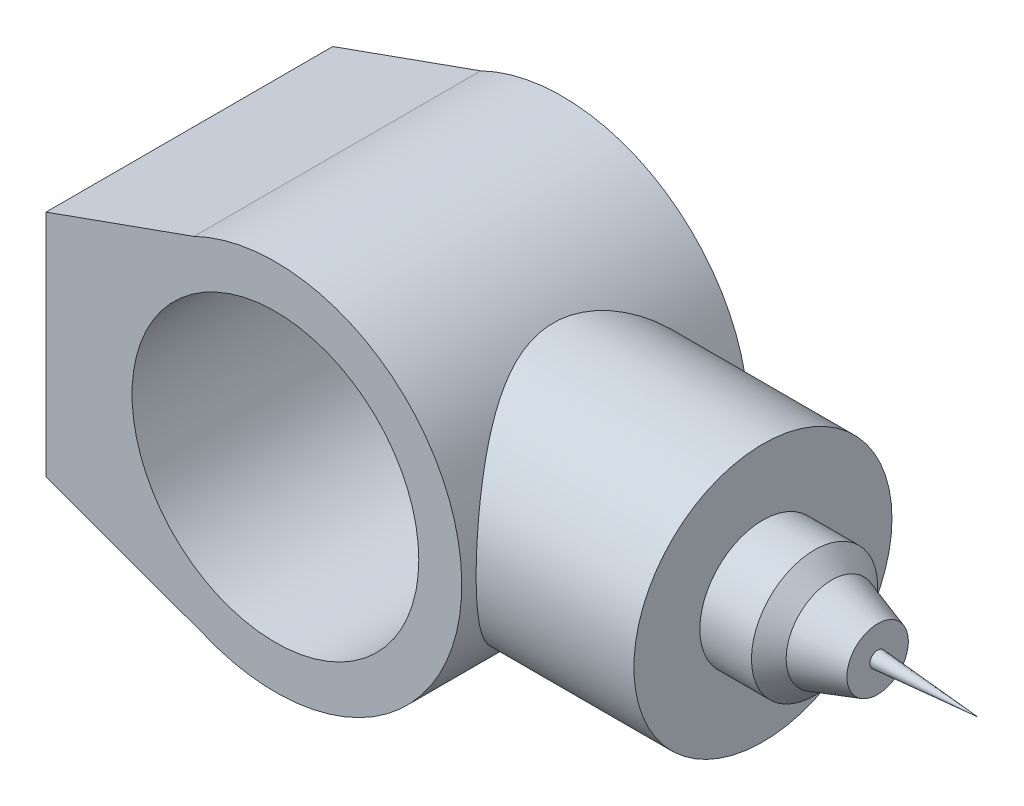
ISO-10303-21;
HEADER;
FILE_DESCRIPTION(('STEP AP214'),'2;1');
FILE_NAME('part.step','',(''),(''),'','','');
FILE_SCHEMA(('AUTOMOTIVE_DESIGN { 1 0 10303 214 1 1 1 1 }'));
ENDSEC;
DATA;
#1=APPLICATION_CONTEXT('core data for automotive mechanical design processes');
#2=APPLICATION_PROTOCOL_DEFINITION('international standard','automotive_design',2000,#1);
#3=PRODUCT_CONTEXT('',#1,'mechanical');
#4=PRODUCT('Part','Part','',(#3));
#5=PRODUCT_RELATED_PRODUCT_CATEGORY('part','',(#4));
#6=PRODUCT_DEFINITION_FORMATION('','',#4);
#7=PRODUCT_DEFINITION_CONTEXT('part definition',#1,'design');
#8=PRODUCT_DEFINITION('design','',#6,#7);
#9=PRODUCT_DEFINITION_SHAPE('','',#8);
#10=(LENGTH_UNIT() NAMED_UNIT(*) SI_UNIT(.MILLI.,.METRE.));
#11=(NAMED_UNIT(*) PLANE_ANGLE_UNIT() SI_UNIT($,.RADIAN.));
#12=(NAMED_UNIT(*) SI_UNIT($,.STERADIAN.) SOLID_ANGLE_UNIT());
#13=UNCERTAINTY_MEASURE_WITH_UNIT(LENGTH_MEASURE(1.E-05),#10,'distance_accuracy_value','');
#14=(GEOMETRIC_REPRESENTATION_CONTEXT(3) GLOBAL_UNCERTAINTY_ASSIGNED_CONTEXT((#13)) GLOBAL_UNIT_ASSIGNED_CONTEXT((#10,
#11,#12)) REPRESENTATION_CONTEXT('',''));
#15=CARTESIAN_POINT('',(0.,0.,0.));
#16=DIRECTION('',(0.,0.,1.));
#17=DIRECTION('',(1.,0.,0.));
#18=AXIS2_PLACEMENT_3D('',#15,#16,#17);
#19=CARTESIAN_POINT('',(0.,0.,500.));
#20=DIRECTION('',(0.,0.,1.));
#21=DIRECTION('',(1.,0.,0.));
#22=AXIS2_PLACEMENT_3D('',#19,#20,#21);
#23=PLANE('',#22);
#24=DIRECTION('',(0.940002007833279,-0.341168910174131,0.));
#25=VECTOR('',#24,1.);
#26=CARTESIAN_POINT('',(-800.,-400.,500.));
#27=LINE('',#26,#25);
#28=CARTESIAN_POINT('',(-800.,-400.,500.));
#29=VERTEX_POINT('',#28);
#30=CARTESIAN_POINT('',(-256.343570218804,-597.317314337595,500.));
#31=VERTEX_POINT('',#30);
#32=EDGE_CURVE('E191',#29,#31,#27,.T.);
#33=ORIENTED_EDGE('',*,*,#32,.T.);
#34=CARTESIAN_POINT('',(0.,0.,500.));
#35=DIRECTION('',(0.,0.,1.));
#36=DIRECTION('',(1.,0.,0.));
#37=AXIS2_PLACEMENT_3D('',#34,#35,#36);
#38=CIRCLE('',#37,650.);
#39=CARTESIAN_POINT('',(-284.326048032078,584.51578114749,500.));
#40=VERTEX_POINT('',#39);
#41=EDGE_CURVE('E88',#31,#40,#38,.T.);
#42=ORIENTED_EDGE('',*,*,#41,.T.);
#43=DIRECTION('',(-0.941541348464522,-0.336897446015267,0.));
#44=VECTOR('',#43,1.);
#45=CARTESIAN_POINT('',(-800.,400.,500.));
#46=LINE('',#45,#44);
#47=CARTESIAN_POINT('',(-800.,400.,500.));
#48=VERTEX_POINT('',#47);
#49=EDGE_CURVE('E184',#40,#48,#46,.T.);
#50=ORIENTED_EDGE('',*,*,#49,.T.);
#51=DIRECTION('',(0.,-1.,0.));
#52=VECTOR('',#51,1.);
#53=CARTESIAN_POINT('',(-800.,400.,500.));
#54=LINE('',#53,#52);
#55=EDGE_CURVE('E57',#48,#29,#54,.T.);
#56=ORIENTED_EDGE('',*,*,#55,.T.);
#57=EDGE_LOOP('',(#33,#42,#50,#56));
#58=FACE_BOUND('',#57,.T.);
#59=CARTESIAN_POINT('',(0.,0.,500.));
#60=DIRECTION('',(0.,0.,1.));
#61=DIRECTION('',(1.,0.,0.));
#62=AXIS2_PLACEMENT_3D('',#59,#60,#61);
#63=CIRCLE('',#62,500.);
#64=CARTESIAN_POINT('',(500.,0.,500.));
#65=VERTEX_POINT('',#64);
#66=EDGE_CURVE('E206',#65,#65,#63,.T.);
#67=ORIENTED_EDGE('',*,*,#66,.F.);
#68=EDGE_LOOP('',(#67));
#69=FACE_BOUND('',#68,.T.);
#70=ADVANCED_FACE('F39',(#58,#69),#23,.T.);
#71=CARTESIAN_POINT('',(0.,0.,-500.));
#72=DIRECTION('',(0.,0.,1.));
#73=DIRECTION('',(1.,0.,0.));
#74=AXIS2_PLACEMENT_3D('',#71,#72,#73);
#75=PLANE('',#74);
#76=DIRECTION('',(0.940002007833279,-0.341168910174131,0.));
#77=VECTOR('',#76,1.);
#78=CARTESIAN_POINT('',(-800.,-400.,-500.));
#79=LINE('',#78,#77);
#80=CARTESIAN_POINT('',(-800.,-400.,-500.));
#81=VERTEX_POINT('',#80);
#82=CARTESIAN_POINT('',(-256.343570218804,-597.317314337595,-500.));
#83=VERTEX_POINT('',#82);
#84=EDGE_CURVE('E182',#81,#83,#79,.T.);
#85=ORIENTED_EDGE('',*,*,#84,.F.);
#86=DIRECTION('',(0.,-1.,0.));
#87=VECTOR('',#86,1.);
#88=CARTESIAN_POINT('',(-800.,400.,-500.));
#89=LINE('',#88,#87);
#90=CARTESIAN_POINT('',(-800.,400.,-500.));
#91=VERTEX_POINT('',#90);
#92=EDGE_CURVE('E81',#91,#81,#89,.T.);
#93=ORIENTED_EDGE('',*,*,#92,.F.);
#94=DIRECTION('',(-0.941541348464522,-0.336897446015267,0.));
#95=VECTOR('',#94,1.);
#96=CARTESIAN_POINT('',(-800.,400.,-500.));
#97=LINE('',#96,#95);
#98=CARTESIAN_POINT('',(-284.326048032078,584.51578114749,-500.));
#99=VERTEX_POINT('',#98);
#100=EDGE_CURVE('E75',#99,#91,#97,.T.);
#101=ORIENTED_EDGE('',*,*,#100,.F.);
#102=CARTESIAN_POINT('',(0.,0.,-500.));
#103=DIRECTION('',(0.,0.,1.));
#104=DIRECTION('',(1.,0.,0.));
#105=AXIS2_PLACEMENT_3D('',#102,#103,#104);
#106=CIRCLE('',#105,650.);
#107=EDGE_CURVE('E176',#83,#99,#106,.T.);
#108=ORIENTED_EDGE('',*,*,#107,.F.);
#109=EDGE_LOOP('',(#85,#93,#101,#108));
#110=FACE_BOUND('',#109,.T.);
#111=CARTESIAN_POINT('',(0.,0.,-500.));
#112=DIRECTION('',(0.,0.,1.));
#113=DIRECTION('',(1.,0.,0.));
#114=AXIS2_PLACEMENT_3D('',#111,#112,#113);
#115=CIRCLE('',#114,500.);
#116=CARTESIAN_POINT('',(500.,0.,-500.));
#117=VERTEX_POINT('',#116);
#118=EDGE_CURVE('E209',#117,#117,#115,.T.);
#119=ORIENTED_EDGE('',*,*,#118,.T.);
#120=EDGE_LOOP('',(#119));
#121=FACE_BOUND('',#120,.T.);
#122=ADVANCED_FACE('F155',(#110,#121),#75,.F.);
#123=CARTESIAN_POINT('',(-800.,-400.,500.));
#124=DIRECTION('',(0.341168910174131,0.940002007833279,0.));
#125=DIRECTION('',(-0.940002007833279,0.341168910174131,0.));
#126=AXIS2_PLACEMENT_3D('',#123,#124,#125);
#127=PLANE('',#126);
#128=ORIENTED_EDGE('',*,*,#84,.T.);
#129=DIRECTION('',(0.,0.,-1.));
#130=VECTOR('',#129,1.);
#131=CARTESIAN_POINT('',(-256.343570218804,-597.317314337595,500.));
#132=LINE('',#131,#130);
#133=EDGE_CURVE('E11',#31,#83,#132,.T.);
#134=ORIENTED_EDGE('',*,*,#133,.F.);
#135=ORIENTED_EDGE('',*,*,#32,.F.);
#136=DIRECTION('',(0.,0.,-1.));
#137=VECTOR('',#136,1.);
#138=CARTESIAN_POINT('',(-800.,-400.,500.));
#139=LINE('',#138,#137);
#140=EDGE_CURVE('E195',#29,#81,#139,.T.);
#141=ORIENTED_EDGE('',*,*,#140,.T.);
#142=EDGE_LOOP('',(#128,#134,#135,#141));
#143=FACE_BOUND('',#142,.T.);
#144=ADVANCED_FACE('F41',(#143),#127,.F.);
#145=CARTESIAN_POINT('',(0.,0.,500.));
#146=DIRECTION('',(0.,0.,-1.));
#147=DIRECTION('',(-1.,0.,0.));
#148=AXIS2_PLACEMENT_3D('',#145,#146,#147);
#149=CYLINDRICAL_SURFACE('',#148,650.);
#150=CARTESIAN_POINT('',(650.,0.,-450.));
#151=CARTESIAN_POINT('',(650.000000819909,5.60735448326354,-450.000000874373));
#152=CARTESIAN_POINT('',(649.927403210005,11.2146861362403,-449.895156959561));
#153=CARTESIAN_POINT('',(649.63746991911,22.4177465576838,-449.476212092785));
#154=CARTESIAN_POINT('',(649.420135102394,28.0134753952345,-449.162112390356));
#155=CARTESIAN_POINT('',(648.842087681497,39.1817691708137,-448.32593717228));
#156=CARTESIAN_POINT('',(648.481378840438,44.7543347129279,-447.803867115207));
#157=CARTESIAN_POINT('',(647.618804173417,55.8653233636817,-446.553826656444));
#158=CARTESIAN_POINT('',(647.116938089727,61.4037464099647,-445.825855878818));
#159=CARTESIAN_POINT('',(645.974897280944,72.4375973578085,-444.166556842931));
#160=CARTESIAN_POINT('',(645.334675523368,77.9330099785567,-443.235159430883));
#161=CARTESIAN_POINT('',(643.91982926804,88.8687342421325,-441.172652681231));
#162=CARTESIAN_POINT('',(643.145204741963,94.3090458733477,-440.041543301539));
#163=CARTESIAN_POINT('',(641.466040982058,105.125021827595,-437.583691431635));
#164=CARTESIAN_POINT('',(640.561501022899,110.500685789512,-436.256947849179));
#165=CARTESIAN_POINT('',(638.627608420713,121.178450692091,-433.41240179995));
#166=CARTESIAN_POINT('',(637.598255819654,126.48055165749,-431.894599397423));
#167=CARTESIAN_POINT('',(635.425768160247,136.976911844193,-428.680885766921));
#168=CARTESIAN_POINT('',(634.283223366166,142.171575778475,-426.985896201959));
#169=CARTESIAN_POINT('',(631.886097278452,152.472703749141,-423.416801666323));
#170=CARTESIAN_POINT('',(630.63151608328,157.579167863034,-421.542696853062));
#171=CARTESIAN_POINT('',(628.016674999887,167.697223968914,-417.620737119684));
#172=CARTESIAN_POINT('',(626.656417578098,172.708818171727,-415.572886254614));
#173=CARTESIAN_POINT('',(623.836810050851,182.631423926088,-411.308793519383));
#174=CARTESIAN_POINT('',(622.377459820085,187.542435350434,-409.092551436281));
#175=CARTESIAN_POINT('',(619.366542851209,197.258593533155,-404.497129035471));
#176=CARTESIAN_POINT('',(617.814978344527,202.063742849357,-402.117952660284));
#177=CARTESIAN_POINT('',(614.626617263451,211.563762782533,-397.201937361689));
#178=CARTESIAN_POINT('',(612.989820915786,216.258633692815,-394.665098857683));
#179=CARTESIAN_POINT('',(609.638083043462,225.534313806631,-389.438842938195));
#180=CARTESIAN_POINT('',(607.923139157841,230.1151195576,-386.749420912321));
#181=CARTESIAN_POINT('',(604.422390562658,239.159124959121,-381.223028745398));
#182=CARTESIAN_POINT('',(602.636585093933,243.622323348855,-378.386057023502));
#183=CARTESIAN_POINT('',(598.842327387006,252.813570367209,-372.314693446354));
#184=CARTESIAN_POINT('',(596.828068972455,257.530605705433,-369.067251028323));
#185=CARTESIAN_POINT('',(592.733929761899,266.818754136987,-362.409166112294));
#186=CARTESIAN_POINT('',(590.654048079459,271.389865257503,-358.998521409448));
#187=CARTESIAN_POINT('',(586.438246947194,280.383393417811,-352.019249824947));
#188=CARTESIAN_POINT('',(584.302325907629,284.805806231152,-348.450618459506));
#189=CARTESIAN_POINT('',(579.984258706197,293.499259359902,-341.160323385042));
#190=CARTESIAN_POINT('',(577.80211262573,297.770299941836,-337.438659945492));
#191=CARTESIAN_POINT('',(573.398466001337,306.164487771874,-329.841470322231));
#192=CARTESIAN_POINT('',(571.176915566076,310.287424048353,-325.965740024425));
#193=CARTESIAN_POINT('',(566.707517540193,318.37704678997,-318.069183800029));
#194=CARTESIAN_POINT('',(564.459670072296,322.34373398393,-314.0483585504));
#195=CARTESIAN_POINT('',(559.947923215529,330.118957790286,-305.864890092382));
#196=CARTESIAN_POINT('',(557.684023100944,333.927487198572,-301.702240439559));
#197=CARTESIAN_POINT('',(553.150917051217,341.384096988457,-293.238314795031));
#198=CARTESIAN_POINT('',(550.881710999232,345.032173801003,-288.937035723386));
#199=CARTESIAN_POINT('',(545.959207282111,352.779066684507,-279.447001589225));
#200=CARTESIAN_POINT('',(543.306972217361,356.847497036008,-274.232840983926));
#201=CARTESIAN_POINT('',(538.028913090799,364.756759565165,-263.621504406309));
#202=CARTESIAN_POINT('',(535.403089787306,368.597585223371,-258.224323198551));
#203=CARTESIAN_POINT('',(530.196809449092,376.047870512711,-247.248866252988));
#204=CARTESIAN_POINT('',(527.616364367663,379.657269826135,-241.670543869636));
#205=CARTESIAN_POINT('',(522.522375241127,386.638122025411,-230.337265840221));
#206=CARTESIAN_POINT('',(520.00883027164,390.009578200065,-224.582312637091));
#207=CARTESIAN_POINT('',(515.073934002506,396.504039693009,-212.906348871407));
#208=CARTESIAN_POINT('',(512.652466995795,399.627362588383,-206.985564127364));
#209=CARTESIAN_POINT('',(507.92171687634,405.623117209003,-194.974215933042));
#210=CARTESIAN_POINT('',(505.612436981933,408.495541738552,-188.883647620019));
#211=CARTESIAN_POINT('',(501.131881137214,413.979915608787,-176.539561927493));
#212=CARTESIAN_POINT('',(498.960546046449,416.591976850894,-170.28611602139));
#213=CARTESIAN_POINT('',(495.826271825366,420.308143127775,-160.787513074257));
#214=CARTESIAN_POINT('',(494.80199235564,421.513183588448,-157.601653513431));
#215=CARTESIAN_POINT('',(492.797541599884,423.854878577852,-151.190897350712));
#216=CARTESIAN_POINT('',(491.817372604764,424.991529555757,-147.965998732308));
#217=CARTESIAN_POINT('',(489.53457036154,427.621326873819,-140.223302532042));
#218=CARTESIAN_POINT('',(488.253895599728,429.082257956713,-135.688013866448));
#219=CARTESIAN_POINT('',(485.793325579629,431.866062741324,-126.548499775889));
#220=CARTESIAN_POINT('',(484.61342519084,433.188943472053,-121.944277874412));
#221=CARTESIAN_POINT('',(482.36356361326,435.692810924993,-112.671358596193));
#222=CARTESIAN_POINT('',(481.293589507026,436.873814321983,-108.002668868378));
#223=CARTESIAN_POINT('',(479.272312706538,439.090310231464,-98.6052992628276));
#224=CARTESIAN_POINT('',(478.321011366921,440.125801082959,-93.876618700981));
#225=CARTESIAN_POINT('',(476.546995540197,442.046001565262,-84.3729554241327));
#226=CARTESIAN_POINT('',(475.724076121008,442.930951708024,-79.598059695749));
#227=CARTESIAN_POINT('',(474.212758121207,444.548631690904,-70.001368946452));
#228=CARTESIAN_POINT('',(473.524358885131,445.281362272728,-65.1795741541795));
#229=CARTESIAN_POINT('',(472.288928882528,446.591512458957,-55.4967504410991));
#230=CARTESIAN_POINT('',(471.741901262738,447.168928606286,-50.6357206494569));
#231=CARTESIAN_POINT('',(470.794945593637,448.165808974127,-40.8831718362629));
#232=CARTESIAN_POINT('',(470.395017710037,448.585273016701,-35.9916527803707));
#233=CARTESIAN_POINT('',(469.744834446091,449.266083500543,-26.1609199994822));
#234=CARTESIAN_POINT('',(469.495401528478,449.526561161451,-21.2215914469815));
#235=CARTESIAN_POINT('',(469.15240817099,449.884518015706,-11.3316058365826));
#236=CARTESIAN_POINT('',(469.058847812111,449.981997124355,-6.38094877279899));
#237=CARTESIAN_POINT('',(469.028662632765,450.013459946033,3.5213591755549));
#238=CARTESIAN_POINT('',(469.092037602306,449.947443877832,8.47301005878656));
#239=CARTESIAN_POINT('',(469.375001640919,449.652253906846,18.3669553978904));
#240=CARTESIAN_POINT('',(469.594590651175,449.42308006549,23.3092498572846));
#241=CARTESIAN_POINT('',(470.187688901759,448.802541389342,33.1773235140838));
#242=CARTESIAN_POINT('',(470.56129012844,448.411079624603,38.103091064974));
#243=CARTESIAN_POINT('',(471.458306867068,447.467862463318,47.9255153600554));
#244=CARTESIAN_POINT('',(471.981722914146,446.91610649421,52.8221720002001));
#245=CARTESIAN_POINT('',(473.172797112469,445.654861705661,62.5774238688978));
#246=CARTESIAN_POINT('',(473.840455776078,444.945372325935,67.436018962189));
#247=CARTESIAN_POINT('',(475.313213593544,443.371751184742,77.1070129615799));
#248=CARTESIAN_POINT('',(476.118311610456,442.507620702518,81.9194122494795));
#249=CARTESIAN_POINT('',(477.805192006275,440.685424715542,91.1994270571938));
#250=CARTESIAN_POINT('',(478.679320952941,439.736281784658,95.6701952256573));
#251=CARTESIAN_POINT('',(480.534905201015,437.707772468309,104.559502012579));
#252=CARTESIAN_POINT('',(481.516359224419,436.628407633483,108.978041252275));
#253=CARTESIAN_POINT('',(483.579079172385,434.342771445386,117.757940043559));
#254=CARTESIAN_POINT('',(484.660332506468,433.136516097691,122.119306728855));
#255=CARTESIAN_POINT('',(486.915229524819,430.600091476401,130.78200354183));
#256=CARTESIAN_POINT('',(488.088880166584,429.269912870026,135.083329119661));
#257=CARTESIAN_POINT('',(490.521492675331,426.48807754917,143.624872838719));
#258=CARTESIAN_POINT('',(491.780500688678,425.036355023715,147.865056398517));
#259=CARTESIAN_POINT('',(494.375496694087,422.015207058528,156.279072550163));
#260=CARTESIAN_POINT('',(495.711483598354,420.445783281949,160.452906078546));
#261=CARTESIAN_POINT('',(499.82407840081,415.564659890422,172.873238637371));
#262=CARTESIAN_POINT('',(502.705252757621,412.080184919393,181.018334841964));
#263=CARTESIAN_POINT('',(507.961008092489,405.571965186945,195.079430096909));
#264=CARTESIAN_POINT('',(510.288884258519,402.641571495044,201.056765600333));
#265=CARTESIAN_POINT('',(515.047283718722,396.536595522342,212.844499633203));
#266=CARTESIAN_POINT('',(517.477815982988,393.361991882479,218.654883499562));
#267=CARTESIAN_POINT('',(522.419656154597,386.774693221208,230.106470187074));
#268=CARTESIAN_POINT('',(524.930990845925,383.361918804664,235.747615687259));
#269=CARTESIAN_POINT('',(530.012606823902,376.305117294406,246.855735176086));
#270=CARTESIAN_POINT('',(532.582886736164,372.66109558904,252.322713218589));
#271=CARTESIAN_POINT('',(537.767155985266,365.140223270321,263.088980498944));
#272=CARTESIAN_POINT('',(540.381213559624,361.262978789571,268.387961594952));
#273=CARTESIAN_POINT('',(545.629896197215,353.285738573182,278.804993874369));
#274=CARTESIAN_POINT('',(548.26452137527,349.185741593212,283.923044046805));
#275=CARTESIAN_POINT('',(553.536135374502,340.76738202179,293.973734984431));
#276=CARTESIAN_POINT('',(556.173123852062,336.44904729687,298.906399271102));
#277=CARTESIAN_POINT('',(561.432719302883,327.597019889698,308.582547668722));
#278=CARTESIAN_POINT('',(564.055326281339,323.063327285238,313.326031848006));
#279=CARTESIAN_POINT('',(569.297492606752,313.73443584979,322.66816132737));
#280=CARTESIAN_POINT('',(571.916721553632,308.936964856633,327.264724071866));
#281=CARTESIAN_POINT('',(577.107180587542,299.128880515629,336.253118711368));
#282=CARTESIAN_POINT('',(579.678410518676,294.118266475689,340.644949941496));
#283=CARTESIAN_POINT('',(584.757017079361,283.887040557402,349.217257344969));
#284=CARTESIAN_POINT('',(587.264386661161,278.666405663351,353.39771023993));
#285=CARTESIAN_POINT('',(592.199110042117,268.01984800001,361.538748513944));
#286=CARTESIAN_POINT('',(594.626464294832,262.593926394744,365.499335139377));
#287=CARTESIAN_POINT('',(599.381309319481,251.551419464176,373.185011169578));
#288=CARTESIAN_POINT('',(601.708970132548,245.935190654162,376.910507149919));
#289=CARTESIAN_POINT('',(606.253653053463,234.508667653585,384.124116907633));
#290=CARTESIAN_POINT('',(608.470673402873,228.69837038109,387.612226912489));
#291=CARTESIAN_POINT('',(612.778458371332,216.891753104365,394.340100189272));
#292=CARTESIAN_POINT('',(614.869254002465,210.89547934515,397.57992451551));
#293=CARTESIAN_POINT('',(617.899720108414,201.767732039139,402.245522502413));
#294=CARTESIAN_POINT('',(618.892245509465,198.702955965905,403.768352146707));
#295=CARTESIAN_POINT('',(620.840394422758,192.529687721492,406.748161265177));
#296=CARTESIAN_POINT('',(621.796015741298,189.421192966469,408.205136825644));
#297=CARTESIAN_POINT('',(624.189428186075,181.420518196595,411.843692866751));
#298=CARTESIAN_POINT('',(625.599670489406,176.498185961971,413.977413325344));
#299=CARTESIAN_POINT('',(628.319510920224,166.556746217949,418.076258926038));
#300=CARTESIAN_POINT('',(629.629112725439,161.537642253293,420.041390229236));
#301=CARTESIAN_POINT('',(632.141245112203,151.408941180459,423.797715239185));
#302=CARTESIAN_POINT('',(633.343787385543,146.299354027046,425.588927941237));
#303=CARTESIAN_POINT('',(635.635888473643,135.995850070213,428.992500445599));
#304=CARTESIAN_POINT('',(636.725446171889,130.801932434026,430.604858480479));
#305=CARTESIAN_POINT('',(638.78536033072,120.339825349398,433.644999781103));
#306=CARTESIAN_POINT('',(639.755775223972,115.071673733148,435.072873543865));
#307=CARTESIAN_POINT('',(641.572784179855,104.46675765443,437.740323620274));
#308=CARTESIAN_POINT('',(642.419378650747,99.1299934182548,438.979900554778));
#309=CARTESIAN_POINT('',(643.984066896253,88.3964721410954,441.266556248671));
#310=CARTESIAN_POINT('',(644.702156156229,82.999712999445,442.313628245023));
#311=CARTESIAN_POINT('',(646.00569314655,72.1558468371084,444.21147137247));
#312=CARTESIAN_POINT('',(646.591140720724,66.7087397571504,445.06224227244));
#313=CARTESIAN_POINT('',(647.627957928679,55.7531936458605,446.567207282729));
#314=CARTESIAN_POINT('',(648.078803580627,50.2445993518538,447.220633275191));
#315=CARTESIAN_POINT('',(648.840672075895,39.1974134990121,448.323964350849));
#316=CARTESIAN_POINT('',(649.151694842159,33.6588219236473,448.773869321884));
#317=CARTESIAN_POINT('',(649.632024710828,22.5626137050633,449.468386517747));
#318=CARTESIAN_POINT('',(649.801331206717,17.0049969805227,449.71299786396));
#319=CARTESIAN_POINT('',(649.997185993398,5.88200117085642,449.995946915194));
#320=CARTESIAN_POINT('',(650.023734425498,0.31662209341976,450.034284824394));
#321=CARTESIAN_POINT('',(649.933909828198,-10.8105797622006,449.904533569934));
#322=CARTESIAN_POINT('',(649.817536589639,-16.3724025351678,449.736444104178));
#323=CARTESIAN_POINT('',(649.442583658528,-27.4812168447602,449.194509900233));
#324=CARTESIAN_POINT('',(649.184003514888,-33.0282083342836,448.820664509374));
#325=CARTESIAN_POINT('',(648.526229409065,-44.0960509138614,447.868717961217));
#326=CARTESIAN_POINT('',(648.127040121496,-49.6169028667534,447.290623594265));
#327=CARTESIAN_POINT('',(647.19045723617,-60.621842767825,445.932427474686));
#328=CARTESIAN_POINT('',(646.653065204287,-66.1059311318239,445.152328010831));
#329=CARTESIAN_POINT('',(645.479959579352,-76.6958789107769,443.446431443875));
#330=CARTESIAN_POINT('',(644.852182930614,-81.804510404939,442.532336009031));
#331=CARTESIAN_POINT('',(643.480730386418,-91.9720831399342,440.531475691998));
#332=CARTESIAN_POINT('',(642.737055882384,-97.0310249765469,439.444712882781));
#333=CARTESIAN_POINT('',(641.137575502896,-107.091317958847,437.101959642227));
#334=CARTESIAN_POINT('',(640.281775968853,-112.092672344095,435.845978781172));
#335=CARTESIAN_POINT('',(638.462182846401,-122.030986847998,433.168470009242));
#336=CARTESIAN_POINT('',(637.498388818144,-126.96794670429,431.746941424108));
#337=CARTESIAN_POINT('',(635.467305246677,-136.77120801915,428.742255641101));
#338=CARTESIAN_POINT('',(634.400008806713,-141.637504744294,427.159087672218));
#339=CARTESIAN_POINT('',(632.166874407228,-151.293084893797,423.835430320864));
#340=CARTESIAN_POINT('',(631.00103674892,-156.082368553511,422.094941419279));
#341=CARTESIAN_POINT('',(628.575940726446,-165.578691903253,418.460923580761));
#342=CARTESIAN_POINT('',(627.316678719135,-170.285728377143,416.567388675436));
#343=CARTESIAN_POINT('',(624.710167961164,-179.612507102553,412.631757976447));
#344=CARTESIAN_POINT('',(623.36291834741,-184.232248497197,410.58966072547));
#345=CARTESIAN_POINT('',(620.482272558971,-193.721807535725,406.203381104607));
#346=CARTESIAN_POINT('',(618.942489087119,-198.58452506884,403.848028078087));
#347=CARTESIAN_POINT('',(615.774844356818,-208.199332149116,398.97629486368));
#348=CARTESIAN_POINT('',(614.146982043564,-212.951420370439,396.459912747292));
#349=CARTESIAN_POINT('',(610.810413452344,-222.340871337021,391.271399808098));
#350=CARTESIAN_POINT('',(609.101705633027,-226.978231892383,388.599266015601));
#351=CARTESIAN_POINT('',(605.610847563263,-236.134511516119,383.104425107261));
#352=CARTESIAN_POINT('',(603.82869743564,-240.653430782555,380.281718243235));
#353=CARTESIAN_POINT('',(600.197460084888,-249.572039805062,374.48909994937));
#354=CARTESIAN_POINT('',(598.348338418218,-253.971666114882,371.519112474526));
#355=CARTESIAN_POINT('',(594.591589804732,-262.646498152908,365.437923144632));
#356=CARTESIAN_POINT('',(592.683963085269,-266.921704364491,362.326721838322));
#357=CARTESIAN_POINT('',(588.817741364716,-275.345501339443,355.967283161096));
#358=CARTESIAN_POINT('',(586.859144530781,-279.49408753797,352.719040859678));
#359=CARTESIAN_POINT('',(582.898733007226,-287.662423433926,346.089582485954));
#360=CARTESIAN_POINT('',(580.896917524241,-291.682170762886,342.708363971662));
#361=CARTESIAN_POINT('',(576.514528693077,-300.263192701867,335.230779099987));
#362=CARTESIAN_POINT('',(574.127415869786,-304.800364741423,331.110550354662));
#363=CARTESIAN_POINT('',(569.317391001428,-313.692944550861,322.698310368991));
#364=CARTESIAN_POINT('',(566.894478037004,-318.04834764184,318.406294712252));
#365=CARTESIAN_POINT('',(562.025567438698,-326.575209890851,309.654585358501));
#366=CARTESIAN_POINT('',(559.579566765486,-330.746644408903,305.194869347708));
#367=CARTESIAN_POINT('',(554.678220436927,-338.902206600937,296.112386837679));
#368=CARTESIAN_POINT('',(552.222874855298,-342.886335749199,291.489621622306));
#369=CARTESIAN_POINT('',(547.315070339501,-350.667055912739,282.081379153419));
#370=CARTESIAN_POINT('',(544.862614399941,-354.463520792894,277.29579601646));
#371=CARTESIAN_POINT('',(539.976706196152,-361.862974939762,267.567812156613));
#372=CARTESIAN_POINT('',(537.543254084406,-365.465962655419,262.625410177054));
#373=CARTESIAN_POINT('',(532.710874951935,-372.474481608818,252.58707096013));
#374=CARTESIAN_POINT('',(530.311944018398,-375.880035359424,247.491151329068));
#375=CARTESIAN_POINT('',(525.564396825027,-382.490027899388,237.147731915844));
#376=CARTESIAN_POINT('',(523.215779447421,-385.6944711597,231.900235507223));
#377=CARTESIAN_POINT('',(518.850116800288,-391.54349927585,221.863614773314));
#378=CARTESIAN_POINT('',(516.825824953535,-394.210237886969,217.090541050106));
#379=CARTESIAN_POINT('',(512.842521412021,-399.378507303415,207.429073935083));
#380=CARTESIAN_POINT('',(510.883508794238,-401.88004044517,202.540682175487));
#381=CARTESIAN_POINT('',(507.043794392431,-406.713804094321,192.650403975085));
#382=CARTESIAN_POINT('',(505.163095500948,-409.046028350599,187.648513352684));
#383=CARTESIAN_POINT('',(501.493840089857,-413.536377264142,177.533887610266));
#384=CARTESIAN_POINT('',(499.705283590024,-415.69450188404,172.42115246646));
#385=CARTESIAN_POINT('',(496.237419671908,-419.82816796757,162.096213666069));
#386=CARTESIAN_POINT('',(494.55794309766,-421.803994234236,156.884181058163));
#387=CARTESIAN_POINT('',(491.319868105666,-425.571330741045,146.356743988268));
#388=CARTESIAN_POINT('',(489.761271032567,-427.362838930929,141.041338377194));
#389=CARTESIAN_POINT('',(486.780283713083,-430.755213469091,130.313425992973));
#390=CARTESIAN_POINT('',(485.357868367012,-432.356114961434,124.900937332422));
#391=CARTESIAN_POINT('',(482.663991448326,-435.361396052132,113.984644235101));
#392=CARTESIAN_POINT('',(481.392522163174,-436.765785691847,108.480844480232));
#393=CARTESIAN_POINT('',(479.237742629519,-439.127817360208,98.4286352163002));
#394=CARTESIAN_POINT('',(478.326329945071,-440.11987194428,93.8942983202521));
#395=CARTESIAN_POINT('',(476.620305512831,-441.966815081202,84.7760029962484));
#396=CARTESIAN_POINT('',(475.825690271733,-442.821707736514,80.1920460567881));
#397=CARTESIAN_POINT('',(474.360222072087,-444.391193422654,70.9809277742962));
#398=CARTESIAN_POINT('',(473.689357797569,-445.105799281898,66.3537704222662));
#399=CARTESIAN_POINT('',(472.477439745907,-446.392036512682,57.0626335667277));
#400=CARTESIAN_POINT('',(471.936386828066,-446.963666937779,52.3986538196797));
#401=CARTESIAN_POINT('',(470.989734306411,-447.961095308692,43.0459371159406));
#402=CARTESIAN_POINT('',(470.584006155342,-448.387031661625,38.3572279766336));
#403=CARTESIAN_POINT('',(469.911316486081,-449.091964242861,28.9588318477416));
#404=CARTESIAN_POINT('',(469.644354573606,-449.370960888671,24.2491449178002));
#405=CARTESIAN_POINT('',(469.25190624685,-449.780756797157,14.817318738735));
#406=CARTESIAN_POINT('',(469.126422955594,-449.911552788426,10.0951792170366));
#407=CARTESIAN_POINT('',(469.018237911048,-450.024331198636,0.647479319162375));
#408=CARTESIAN_POINT('',(469.035536258479,-450.006313512603,-4.07808105942419));
#409=CARTESIAN_POINT('',(469.212775381176,-449.821506520351,-13.5257338492035));
#410=CARTESIAN_POINT('',(469.372780372431,-449.654650238847,-18.2478237412391));
#411=CARTESIAN_POINT('',(469.833872246145,-449.172843598071,-27.6775104746844));
#412=CARTESIAN_POINT('',(470.134959091206,-448.857893278058,-32.3851073199357));
#413=CARTESIAN_POINT('',(470.875158723846,-448.08132326324,-41.7771595701631));
#414=CARTESIAN_POINT('',(471.314268731135,-447.619706522832,-46.4616154393526));
#415=CARTESIAN_POINT('',(472.326195818744,-446.551794736391,-55.7994540633225));
#416=CARTESIAN_POINT('',(472.899013350297,-445.9454992021,-60.4528367131832));
#417=CARTESIAN_POINT('',(474.173704484396,-444.589883100734,-69.7267811249094));
#418=CARTESIAN_POINT('',(474.875734763578,-443.840388855926,-74.3472958912302));
#419=CARTESIAN_POINT('',(476.402015103815,-442.201733510327,-83.5430375452971));
#420=CARTESIAN_POINT('',(477.226264191817,-441.312573521492,-88.1182647932938));
#421=CARTESIAN_POINT('',(478.990004504362,-439.397621425639,-97.2180579190677));
#422=CARTESIAN_POINT('',(479.929507030592,-438.371815918393,-101.742618780979));
#423=CARTESIAN_POINT('',(481.916115333565,-436.186929243339,-110.735618366462));
#424=CARTESIAN_POINT('',(482.963224866507,-435.027843422997,-115.204055124818));
#425=CARTESIAN_POINT('',(485.4845210698,-432.214455070221,-125.404925587895));
#426=CARTESIAN_POINT('',(486.992913616341,-430.515584490198,-131.116678841799));
#427=CARTESIAN_POINT('',(490.160149600599,-426.906068517006,-142.430591214172));
#428=CARTESIAN_POINT('',(491.819002854467,-424.995409304807,-148.032743153156));
#429=CARTESIAN_POINT('',(495.269862709773,-420.968875687176,-159.122638568014));
#430=CARTESIAN_POINT('',(497.061902081791,-418.852950736544,-164.61035345835));
#431=CARTESIAN_POINT('',(500.761434189076,-414.422867701338,-175.465241676976));
#432=CARTESIAN_POINT('',(502.668925074593,-412.108712792536,-180.832416934649));
#433=CARTESIAN_POINT('',(506.584951058301,-407.285339860078,-191.448910187105));
#434=CARTESIAN_POINT('',(508.593599661509,-404.775900914245,-196.698085781188));
#435=CARTESIAN_POINT('',(512.69393394376,-399.569655238381,-207.06945414436));
#436=CARTESIAN_POINT('',(514.785619932579,-396.872847809331,-212.191646439612));
#437=CARTESIAN_POINT('',(519.036650320428,-391.296875999586,-222.306324178408));
#438=CARTESIAN_POINT('',(521.195988894965,-388.417727295732,-227.298820720676));
#439=CARTESIAN_POINT('',(525.568109779452,-382.48104798307,-237.152552701393));
#440=CARTESIAN_POINT('',(527.780892176721,-379.423517082802,-242.013787925353));
#441=CARTESIAN_POINT('',(532.296462444148,-373.063034111235,-251.710838650574));
#442=CARTESIAN_POINT('',(534.600155443916,-369.756110518747,-256.543627043469));
#443=CARTESIAN_POINT('',(539.235349594547,-362.963009007152,-266.067788715118));
#444=CARTESIAN_POINT('',(541.566850831138,-359.476830535318,-270.759161557749));
#445=CARTESIAN_POINT('',(546.244492889685,-352.328255478435,-279.998062203879));
#446=CARTESIAN_POINT('',(548.590633601383,-348.665860219178,-284.545591089182));
#447=CARTESIAN_POINT('',(553.285001549645,-341.167514343501,-293.494126697986));
#448=CARTESIAN_POINT('',(555.633228787671,-337.331563605363,-297.895133318725));
#449=CARTESIAN_POINT('',(560.320400931798,-329.487374576476,-306.548829083978));
#450=CARTESIAN_POINT('',(562.659342769004,-325.479083788244,-310.801472309795));
#451=CARTESIAN_POINT('',(567.315499149883,-317.293703929462,-319.153401764225));
#452=CARTESIAN_POINT('',(569.632713845583,-313.11661604108,-323.252689066477));
#453=CARTESIAN_POINT('',(574.234267534453,-304.595557151575,-331.294231398326));
#454=CARTESIAN_POINT('',(576.518603471207,-300.251570771506,-335.236471888263));
#455=CARTESIAN_POINT('',(581.043078091345,-291.399469435605,-342.958962055293));
#456=CARTESIAN_POINT('',(583.283215593053,-286.891350100701,-346.739207404485));
#457=CARTESIAN_POINT('',(588.065648738602,-276.97256416893,-354.729531172628));
#458=CARTESIAN_POINT('',(590.598325975717,-271.53370379387,-358.910450754852));
#459=CARTESIAN_POINT('',(595.572363443892,-260.442889264404,-367.037828696338));
#460=CARTESIAN_POINT('',(598.013721179232,-254.790929294548,-370.984280649438));
#461=CARTESIAN_POINT('',(602.788822376812,-243.278595362425,-378.633454338966));
#462=CARTESIAN_POINT('',(605.122546821012,-237.418184889985,-382.336133051422));
#463=CARTESIAN_POINT('',(609.665410877715,-225.496729354725,-389.486244293167));
#464=CARTESIAN_POINT('',(611.87455206547,-219.43568683027,-392.933680049964));
#465=CARTESIAN_POINT('',(616.149522671197,-207.128343451032,-399.558041132178));
#466=CARTESIAN_POINT('',(618.2155191766,-200.882271166364,-402.73528286519));
#467=CARTESIAN_POINT('',(622.191298365865,-188.207598907508,-408.812049707489));
#468=CARTESIAN_POINT('',(624.101078075021,-181.778995460669,-411.711569528528));
#469=CARTESIAN_POINT('',(627.748504093357,-168.752919817661,-417.219897105213));
#470=CARTESIAN_POINT('',(629.48620089262,-162.155497872964,-419.828790160595));
#471=CARTESIAN_POINT('',(632.775385989549,-148.803802169784,-424.744660593181));
#472=CARTESIAN_POINT('',(634.326887758177,-142.049539800747,-427.051659813094));
#473=CARTESIAN_POINT('',(636.924808673985,-129.83512676776,-430.899963710265));
#474=CARTESIAN_POINT('',(638.008837078688,-124.401463082561,-432.500274438684));
#475=CARTESIAN_POINT('',(640.046085659383,-113.454826439941,-435.499947643631));
#476=CARTESIAN_POINT('',(640.999311792941,-107.941857107247,-436.899319272334));
#477=CARTESIAN_POINT('',(642.769227943169,-96.8466591337841,-439.4919538564));
#478=CARTESIAN_POINT('',(643.585934249281,-91.2644388414921,-440.685241402124));
#479=CARTESIAN_POINT('',(645.077982756661,-80.0402867409882,-442.86141327611));
#480=CARTESIAN_POINT('',(645.753323423283,-74.3983542852481,-443.844295320243));
#481=CARTESIAN_POINT('',(646.957947770385,-63.0700760813749,-445.595095909575));
#482=CARTESIAN_POINT('',(647.487340193846,-57.3837666637796,-446.363174506511));
#483=CARTESIAN_POINT('',(648.397353726909,-45.9741554414585,-447.682204620349));
#484=CARTESIAN_POINT('',(648.777975123345,-40.2508537080763,-448.233156555875));
#485=CARTESIAN_POINT('',(649.387980359324,-28.7792268794687,-449.115631805793));
#486=CARTESIAN_POINT('',(649.617362072929,-23.0309014336345,-449.447152035687));
#487=CARTESIAN_POINT('',(649.923371068996,-11.5217092485528,-449.88933510083));
#488=CARTESIAN_POINT('',(649.999999157647,-5.76084257565489,-449.999999101693));
#489=CARTESIAN_POINT('',(650.,0.,-450.));
#490=B_SPLINE_CURVE_WITH_KNOTS('',3,(#150,#151,#152,#153,#154,#155,#156,#157,#158,#159,#160,
#161,#162,#163,#164,#165,#166,#167,#168,#169,#170,#171,#172,#173,#174,#175,#176,#177,#178,#179,
#180,#181,#182,#183,#184,#185,#186,#187,#188,#189,#190,#191,#192,#193,#194,#195,#196,#197,#198,
#199,#200,#201,#202,#203,#204,#205,#206,#207,#208,#209,#210,#211,#212,#213,#214,#215,#216,#217,
#218,#219,#220,#221,#222,#223,#224,#225,#226,#227,#228,#229,#230,#231,#232,#233,#234,#235,#236,
#237,#238,#239,#240,#241,#242,#243,#244,#245,#246,#247,#248,#249,#250,#251,#252,#253,#254,#255,
#256,#257,#258,#259,#260,#261,#262,#263,#264,#265,#266,#267,#268,#269,#270,#271,#272,#273,#274,
#275,#276,#277,#278,#279,#280,#281,#282,#283,#284,#285,#286,#287,#288,#289,#290,#291,#292,#293,
#294,#295,#296,#297,#298,#299,#300,#301,#302,#303,#304,#305,#306,#307,#308,#309,#310,#311,#312,
#313,#314,#315,#316,#317,#318,#319,#320,#321,#322,#323,#324,#325,#326,#327,#328,#329,#330,#331,
#332,#333,#334,#335,#336,#337,#338,#339,#340,#341,#342,#343,#344,#345,#346,#347,#348,#349,#350,
#351,#352,#353,#354,#355,#356,#357,#358,#359,#360,#361,#362,#363,#364,#365,#366,#367,#368,#369,
#370,#371,#372,#373,#374,#375,#376,#377,#378,#379,#380,#381,#382,#383,#384,#385,#386,#387,#388,
#389,#390,#391,#392,#393,#394,#395,#396,#397,#398,#399,#400,#401,#402,#403,#404,#405,#406,#407,
#408,#409,#410,#411,#412,#413,#414,#415,#416,#417,#418,#419,#420,#421,#422,#423,#424,#425,#426,
#427,#428,#429,#430,#431,#432,#433,#434,#435,#436,#437,#438,#439,#440,#441,#442,#443,#444,#445,
#446,#447,#448,#449,#450,#451,#452,#453,#454,#455,#456,#457,#458,#459,#460,#461,#462,#463,#464,
#465,#466,#467,#468,#469,#470,#471,#472,#473,#474,#475,#476,#477,#478,#479,#480,#481,#482,#483,
#484,#485,#486,#487,#488,#489),.UNSPECIFIED.,.T.,.F.,(4,2,2,2,2,2,2,2,2,2,2,2,2,2,2,2,2,2,2,2,2,
2,2,2,2,2,2,2,2,2,2,2,2,2,2,2,2,2,2,2,2,2,2,2,2,2,2,2,2,2,2,2,2,2,2,2,2,2,2,2,2,2,2,2,2,2,2,2,2,
2,2,2,2,2,2,2,2,2,2,2,2,2,2,2,2,2,2,2,2,2,2,2,2,2,2,2,2,2,2,2,2,2,2,2,2,2,2,2,2,2,2,2,2,2,2,2,2,
2,2,2,2,2,2,2,2,2,2,2,2,2,2,2,2,2,2,2,2,2,2,2,2,2,2,2,2,2,2,2,2,2,2,2,2,2,2,2,2,2,2,2,2,2,2,2,2,
2,2,2,2,4),(0.,16.8205773786285,33.641054316936,50.4610897991855,67.2811559918528,
84.1069489997765,100.932745553672,117.758636051259,134.584520891087,151.326870699469,
168.06920579434,184.811150248487,201.553115874171,218.294676537669,235.036192668354,
251.778214922516,268.52041658748,286.728090177017,304.936009819965,323.144446549784,
341.352851217929,359.586240353523,377.819544429473,396.053678126051,414.288217211442,
435.658828709186,457.030052045563,478.406823007981,499.783298447257,521.131958717338,
542.481231060292,563.821287782927,574.490787223328,585.160840153976,599.9590590025,
614.756524012431,629.552248177846,644.348141219637,659.120168892057,673.892124584447,
688.66440905203,703.436710160878,718.289028157605,733.141353871974,747.993659712737,
762.845959961566,777.707143875293,792.568380873058,807.429670660285,822.290837515755,
836.247180524463,850.20335736201,864.15777591681,878.113246243268,892.076322359434,
906.03920121053,933.965725766595,955.116224754617,976.268575712916,997.428011883349,
1018.58695519365,1039.78269370343,1060.97855062826,1082.17170911304,1103.36485994256,
1124.7838905087,1146.20299062953,1167.6244444491,1189.04577682232,1210.42898510257,
1231.81253312363,1253.19080587014,1263.87974331116,1274.56931516295,1291.20630618452,
1307.84268894734,1324.47725264422,1341.1119807081,1357.73851752909,1374.36499952751,
1390.99206553196,1407.619151113,1424.31014346727,1441.00114501993,1457.69221800618,
1474.38327447087,1491.07435536216,1507.76548919879,1524.45606818361,1541.14645806788,
1556.82488341523,1572.50312054805,1588.18047135551,1603.85788601737,1619.536346043,
1635.21475814569,1650.89378196055,1666.57295959839,1683.42345138235,1700.27414500723,
1717.12516002662,1733.97614686526,1750.83592680748,1767.6956412401,1784.55596277463,
1801.41659407808,1821.14335923145,1840.87063185748,1860.60053869707,1880.33029021663,
1900.0731272726,1919.81612257805,1939.55686219697,1959.29716279746,1976.78416868072,
1994.27092719996,2011.75833102647,2029.24573860618,2046.70534600759,2064.1651475996,
2081.62172495145,2099.07740998134,2113.26464248629,2127.45145057752,2141.63696076245,
2155.8225648476,2169.99465515584,2184.16670519604,2198.33906806656,2212.51144093448,
2226.69019439083,2240.86894408852,2255.04740819264,2269.22592014661,2283.42173886072,
2297.61744455985,2311.81454339608,2326.01213797365,2344.44605277823,2362.88117108906,
2381.320840493,2399.76021453682,2418.2207608261,2436.68137599027,2455.14040614708,
2473.59946646518,2492.47341426346,2511.34742026246,2530.22128428236,2549.09516153907,
2567.97482938194,2586.85436502412,2605.73564452267,2624.61742814394,2646.54813227192,
2668.4794353188,2690.41459874103,2712.34948474908,2734.25831991253,2756.16757217067,
2778.07037696716,2799.97159616841,2817.26806456055,2834.5637449001,2851.85736005666,
2869.15116294041,2886.43204553403,2903.71289480955,2920.99398699243,2938.27498797054),.UNSPECIFIED.);
#491=CARTESIAN_POINT('',(650.,0.,-450.));
#492=VERTEX_POINT('',#491);
#493=EDGE_CURVE('E120',#492,#492,#490,.T.);
#494=ORIENTED_EDGE('',*,*,#493,.F.);
#495=EDGE_LOOP('',(#494));
#496=FACE_BOUND('',#495,.T.);
#497=ORIENTED_EDGE('',*,*,#107,.T.);
#498=DIRECTION('',(0.,0.,-1.));
#499=VECTOR('',#498,1.);
#500=CARTESIAN_POINT('',(-284.326048032078,584.51578114749,500.));
#501=LINE('',#500,#499);
#502=EDGE_CURVE('E49',#40,#99,#501,.T.);
#503=ORIENTED_EDGE('',*,*,#502,.F.);
#504=ORIENTED_EDGE('',*,*,#41,.F.);
#505=ORIENTED_EDGE('',*,*,#133,.T.);
#506=EDGE_LOOP('',(#497,#503,#504,#505));
#507=FACE_BOUND('',#506,.T.);
#508=ADVANCED_FACE('F168',(#496,#507),#149,.T.);
#509=CARTESIAN_POINT('',(-800.,400.,500.));
#510=DIRECTION('',(0.336897446015267,-0.941541348464522,0.));
#511=DIRECTION('',(0.941541348464522,0.336897446015267,0.));
#512=AXIS2_PLACEMENT_3D('',#509,#510,#511);
#513=PLANE('',#512);
#514=ORIENTED_EDGE('',*,*,#100,.T.);
#515=DIRECTION('',(0.,0.,-1.));
#516=VECTOR('',#515,1.);
#517=CARTESIAN_POINT('',(-800.,400.,500.));
#518=LINE('',#517,#516);
#519=EDGE_CURVE('E186',#48,#91,#518,.T.);
#520=ORIENTED_EDGE('',*,*,#519,.F.);
#521=ORIENTED_EDGE('',*,*,#49,.F.);
#522=ORIENTED_EDGE('',*,*,#502,.T.);
#523=EDGE_LOOP('',(#514,#520,#521,#522));
#524=FACE_BOUND('',#523,.T.);
#525=ADVANCED_FACE('F166',(#524),#513,.F.);
#526=CARTESIAN_POINT('',(-800.,400.,500.));
#527=DIRECTION('',(1.,0.,0.));
#528=DIRECTION('',(0.,1.,0.));
#529=AXIS2_PLACEMENT_3D('',#526,#527,#528);
#530=PLANE('',#529);
#531=ORIENTED_EDGE('',*,*,#92,.T.);
#532=ORIENTED_EDGE('',*,*,#140,.F.);
#533=ORIENTED_EDGE('',*,*,#55,.F.);
#534=ORIENTED_EDGE('',*,*,#519,.T.);
#535=EDGE_LOOP('',(#531,#532,#533,#534));
#536=FACE_BOUND('',#535,.T.);
#537=ADVANCED_FACE('F152',(#536),#530,.F.);
#538=CARTESIAN_POINT('',(0.,0.,500.));
#539=DIRECTION('',(0.,0.,-1.));
#540=DIRECTION('',(-1.,0.,0.));
#541=AXIS2_PLACEMENT_3D('',#538,#539,#540);
#542=CYLINDRICAL_SURFACE('',#541,500.);
#543=ORIENTED_EDGE('',*,*,#66,.T.);
#544=EDGE_LOOP('',(#543));
#545=FACE_BOUND('',#544,.T.);
#546=ORIENTED_EDGE('',*,*,#118,.F.);
#547=EDGE_LOOP('',(#546));
#548=FACE_BOUND('',#547,.T.);
#549=ADVANCED_FACE('F142',(#545,#548),#542,.F.);
#550=CARTESIAN_POINT('',(-800.002,0.,0.));
#551=DIRECTION('',(1.,0.,0.));
#552=DIRECTION('',(0.,0.,-1.));
#553=AXIS2_PLACEMENT_3D('',#550,#551,#552);
#554=CYLINDRICAL_SURFACE('',#553,450.);
#555=CARTESIAN_POINT('',(1200.,0.,0.));
#556=DIRECTION('',(1.,0.,0.));
#557=DIRECTION('',(0.,0.,-1.));
#558=AXIS2_PLACEMENT_3D('',#555,#556,#557);
#559=CIRCLE('',#558,450.);
#560=CARTESIAN_POINT('',(1200.,0.,-450.));
#561=VERTEX_POINT('',#560);
#562=EDGE_CURVE('E129',#561,#561,#559,.T.);
#563=ORIENTED_EDGE('',*,*,#562,.F.);
#564=EDGE_LOOP('',(#563));
#565=FACE_BOUND('',#564,.T.);
#566=ORIENTED_EDGE('',*,*,#493,.T.);
#567=EDGE_LOOP('',(#566));
#568=FACE_BOUND('',#567,.T.);
#569=ADVANCED_FACE('F131',(#565,#568),#554,.T.);
#570=CARTESIAN_POINT('',(1200.,0.,0.));
#571=DIRECTION('',(1.,0.,0.));
#572=DIRECTION('',(0.,0.,-1.));
#573=AXIS2_PLACEMENT_3D('',#570,#571,#572);
#574=PLANE('',#573);
#575=CARTESIAN_POINT('',(1200.,0.,0.));
#576=DIRECTION('',(-1.,0.,0.));
#577=DIRECTION('',(0.,0.,1.));
#578=AXIS2_PLACEMENT_3D('',#575,#576,#577);
#579=CIRCLE('',#578,220.);
#580=CARTESIAN_POINT('',(1200.,0.,220.));
#581=VERTEX_POINT('',#580);
#582=EDGE_CURVE('E116',#581,#581,#579,.T.);
#583=ORIENTED_EDGE('',*,*,#582,.T.);
#584=EDGE_LOOP('',(#583));
#585=FACE_BOUND('',#584,.T.);
#586=ORIENTED_EDGE('',*,*,#562,.T.);
#587=EDGE_LOOP('',(#586));
#588=FACE_BOUND('',#587,.T.);
#589=ADVANCED_FACE('F139',(#585,#588),#574,.T.);
#590=CARTESIAN_POINT('',(0.,0.,0.));
#591=DIRECTION('',(-1.,0.,0.));
#592=DIRECTION('',(0.,0.,1.));
#593=AXIS2_PLACEMENT_3D('',#590,#591,#592);
#594=CYLINDRICAL_SURFACE('',#593,220.);
#595=CARTESIAN_POINT('',(1380.,0.,0.));
#596=DIRECTION('',(-1.,0.,0.));
#597=DIRECTION('',(0.,0.,1.));
#598=AXIS2_PLACEMENT_3D('',#595,#596,#597);
#599=CIRCLE('',#598,220.);
#600=CARTESIAN_POINT('',(1380.,0.,220.));
#601=VERTEX_POINT('',#600);
#602=EDGE_CURVE('E112',#601,#601,#599,.T.);
#603=ORIENTED_EDGE('',*,*,#602,.T.);
#604=EDGE_LOOP('',(#603));
#605=FACE_BOUND('',#604,.T.);
#606=ORIENTED_EDGE('',*,*,#582,.F.);
#607=EDGE_LOOP('',(#606));
#608=FACE_BOUND('',#607,.T.);
#609=ADVANCED_FACE('F137',(#605,#608),#594,.T.);
#610=CARTESIAN_POINT('',(1380.,0.,0.));
#611=DIRECTION('',(-1.,0.,0.));
#612=DIRECTION('',(0.,0.,1.));
#613=AXIS2_PLACEMENT_3D('',#610,#611,#612);
#614=CONICAL_SURFACE('',#613,220.,0.793197191208076);
#615=CARTESIAN_POINT('',(1440.,0.,0.));
#616=DIRECTION('',(-1.,0.,0.));
#617=DIRECTION('',(0.,0.,1.));
#618=AXIS2_PLACEMENT_3D('',#615,#616,#617);
#619=CIRCLE('',#618,159.056741035224);
#620=CARTESIAN_POINT('',(1440.,0.,159.056741035224));
#621=VERTEX_POINT('',#620);
#622=EDGE_CURVE('E106',#621,#621,#619,.T.);
#623=ORIENTED_EDGE('',*,*,#622,.T.);
#624=EDGE_LOOP('',(#623));
#625=FACE_BOUND('',#624,.T.);
#626=ORIENTED_EDGE('',*,*,#602,.F.);
#627=EDGE_LOOP('',(#626));
#628=FACE_BOUND('',#627,.T.);
#629=ADVANCED_FACE('F147',(#625,#628),#614,.T.);
#630=CARTESIAN_POINT('',(1440.,0.,0.));
#631=DIRECTION('',(-1.,0.,0.));
#632=DIRECTION('',(0.,0.,1.));
#633=AXIS2_PLACEMENT_3D('',#630,#631,#632);
#634=CONICAL_SURFACE('',#633,159.056741035224,0.314159265358973);
#635=CARTESIAN_POINT('',(1600.,0.,0.));
#636=DIRECTION('',(-1.,0.,0.));
#637=DIRECTION('',(0.,0.,1.));
#638=AXIS2_PLACEMENT_3D('',#635,#636,#637);
#639=CIRCLE('',#638,107.06958963796);
#640=CARTESIAN_POINT('',(1600.,0.,107.06958963796));
#641=VERTEX_POINT('',#640);
#642=EDGE_CURVE('E102',#641,#641,#639,.T.);
#643=ORIENTED_EDGE('',*,*,#642,.T.);
#644=EDGE_LOOP('',(#643));
#645=FACE_BOUND('',#644,.T.);
#646=ORIENTED_EDGE('',*,*,#622,.F.);
#647=EDGE_LOOP('',(#646));
#648=FACE_BOUND('',#647,.T.);
#649=ADVANCED_FACE('F278',(#645,#648),#634,.T.);
#650=CARTESIAN_POINT('',(1600.,-107.06958963796,0.));
#651=DIRECTION('',(1.,0.,0.));
#652=DIRECTION('',(0.,0.,-1.));
#653=AXIS2_PLACEMENT_3D('',#650,#651,#652);
#654=PLANE('',#653);
#655=CARTESIAN_POINT('',(1600.,0.,0.));
#656=DIRECTION('',(-1.,0.,0.));
#657=DIRECTION('',(0.,0.,1.));
#658=AXIS2_PLACEMENT_3D('',#655,#656,#657);
#659=CIRCLE('',#658,27.0695896379604);
#660=CARTESIAN_POINT('',(1600.,0.,27.0695896379604));
#661=VERTEX_POINT('',#660);
#662=EDGE_CURVE('E99',#661,#661,#659,.T.);
#663=ORIENTED_EDGE('',*,*,#662,.T.);
#664=EDGE_LOOP('',(#663));
#665=FACE_BOUND('',#664,.T.);
#666=ORIENTED_EDGE('',*,*,#642,.F.);
#667=EDGE_LOOP('',(#666));
#668=FACE_BOUND('',#667,.T.);
#669=ADVANCED_FACE('F95',(#665,#668),#654,.T.);
#670=CARTESIAN_POINT('',(1600.,0.,0.));
#671=DIRECTION('',(-1.,0.,0.));
#672=DIRECTION('',(0.,0.,1.));
#673=AXIS2_PLACEMENT_3D('',#670,#671,#672);
#674=CONICAL_SURFACE('',#673,27.0695896379604,0.0771880232831205);
#675=CARTESIAN_POINT('',(1950.,0.,0.));
#676=VERTEX_POINT('',#675);
#677=VERTEX_LOOP('',#676);
#678=FACE_BOUND('',#677,.T.);
#679=ORIENTED_EDGE('',*,*,#662,.F.);
#680=EDGE_LOOP('',(#679));
#681=FACE_BOUND('',#680,.T.);
#682=ADVANCED_FACE('F92',(#678,#681),#674,.T.);
#683=CLOSED_SHELL('',(#70,#122,#144,#508,#525,#537,#549,#569,#589,#609,#629,#649,#669,#682));
#684=MANIFOLD_SOLID_BREP('B2',#683);
#685=ADVANCED_BREP_SHAPE_REPRESENTATION('',(#18,#684),#14);
#686=SHAPE_DEFINITION_REPRESENTATION(#9,#685);
ENDSEC;
END-ISO-10303-21;
